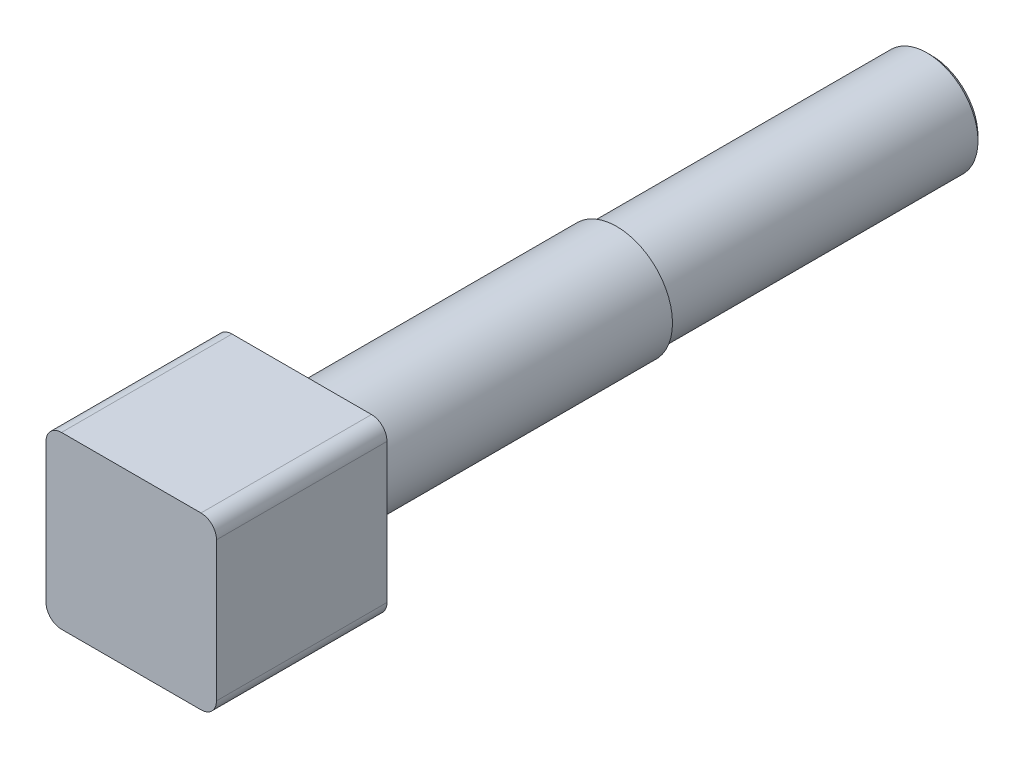
ISO-10303-21;
HEADER;
FILE_DESCRIPTION(('STEP AP214'),'2;1');
FILE_NAME('part.step','',(''),(''),'','','');
FILE_SCHEMA(('AUTOMOTIVE_DESIGN { 1 0 10303 214 1 1 1 1 }'));
ENDSEC;
DATA;
#1=APPLICATION_CONTEXT('core data for automotive mechanical design processes');
#2=APPLICATION_PROTOCOL_DEFINITION('international standard','automotive_design',2000,#1);
#3=PRODUCT_CONTEXT('',#1,'mechanical');
#4=PRODUCT('Part','Part','',(#3));
#5=PRODUCT_RELATED_PRODUCT_CATEGORY('part','',(#4));
#6=PRODUCT_DEFINITION_FORMATION('','',#4);
#7=PRODUCT_DEFINITION_CONTEXT('part definition',#1,'design');
#8=PRODUCT_DEFINITION('design','',#6,#7);
#9=PRODUCT_DEFINITION_SHAPE('','',#8);
#10=(LENGTH_UNIT() NAMED_UNIT(*) SI_UNIT(.MILLI.,.METRE.));
#11=(NAMED_UNIT(*) PLANE_ANGLE_UNIT() SI_UNIT($,.RADIAN.));
#12=(NAMED_UNIT(*) SI_UNIT($,.STERADIAN.) SOLID_ANGLE_UNIT());
#13=UNCERTAINTY_MEASURE_WITH_UNIT(LENGTH_MEASURE(1.E-05),#10,'distance_accuracy_value','');
#14=(GEOMETRIC_REPRESENTATION_CONTEXT(3) GLOBAL_UNCERTAINTY_ASSIGNED_CONTEXT((#13)) GLOBAL_UNIT_ASSIGNED_CONTEXT((#10,
#11,#12)) REPRESENTATION_CONTEXT('',''));
#15=CARTESIAN_POINT('',(0.,0.,0.));
#16=DIRECTION('',(0.,0.,1.));
#17=DIRECTION('',(1.,0.,0.));
#18=AXIS2_PLACEMENT_3D('',#15,#16,#17);
#19=CARTESIAN_POINT('',(0.,0.,203.2));
#20=DIRECTION('',(0.,0.,-1.));
#21=DIRECTION('',(-1.,0.,0.));
#22=AXIS2_PLACEMENT_3D('',#19,#20,#21);
#23=CYLINDRICAL_SURFACE('',#22,18.);
#24=CARTESIAN_POINT('',(0.,0.,101.6));
#25=DIRECTION('',(0.,0.,1.));
#26=DIRECTION('',(1.,0.,0.));
#27=AXIS2_PLACEMENT_3D('',#24,#25,#26);
#28=CIRCLE('',#27,18.);
#29=CARTESIAN_POINT('',(18.,0.,101.6));
#30=VERTEX_POINT('',#29);
#31=EDGE_CURVE('E159',#30,#30,#28,.T.);
#32=ORIENTED_EDGE('',*,*,#31,.T.);
#33=EDGE_LOOP('',(#32));
#34=FACE_BOUND('',#33,.T.);
#35=CARTESIAN_POINT('',(0.,0.,203.2));
#36=DIRECTION('',(0.,0.,1.));
#37=DIRECTION('',(1.,0.,0.));
#38=AXIS2_PLACEMENT_3D('',#35,#36,#37);
#39=CIRCLE('',#38,18.);
#40=CARTESIAN_POINT('',(18.,0.,203.2));
#41=VERTEX_POINT('',#40);
#42=EDGE_CURVE('E124',#41,#41,#39,.T.);
#43=ORIENTED_EDGE('',*,*,#42,.F.);
#44=EDGE_LOOP('',(#43));
#45=FACE_BOUND('',#44,.T.);
#46=ADVANCED_FACE('F17',(#34,#45),#23,.T.);
#47=CARTESIAN_POINT('',(-27.5,27.5,258.2));
#48=DIRECTION('',(1.,0.,0.));
#49=DIRECTION('',(0.,1.,0.));
#50=AXIS2_PLACEMENT_3D('',#47,#48,#49);
#51=PLANE('',#50);
#52=DIRECTION('',(0.,-1.,0.));
#53=VECTOR('',#52,1.);
#54=CARTESIAN_POINT('',(-27.5,27.5,203.2));
#55=LINE('',#54,#53);
#56=CARTESIAN_POINT('',(-27.5,22.5,203.2));
#57=VERTEX_POINT('',#56);
#58=CARTESIAN_POINT('',(-27.5,-22.5,203.2));
#59=VERTEX_POINT('',#58);
#60=EDGE_CURVE('E151',#57,#59,#55,.T.);
#61=ORIENTED_EDGE('',*,*,#60,.T.);
#62=DIRECTION('',(0.,0.,-1.));
#63=VECTOR('',#62,1.);
#64=CARTESIAN_POINT('',(-27.5,-22.5,258.2));
#65=LINE('',#64,#63);
#66=CARTESIAN_POINT('',(-27.5,-22.5,258.2));
#67=VERTEX_POINT('',#66);
#68=EDGE_CURVE('E11',#59,#67,#65,.F.);
#69=ORIENTED_EDGE('',*,*,#68,.T.);
#70=DIRECTION('',(0.,-1.,0.));
#71=VECTOR('',#70,1.);
#72=CARTESIAN_POINT('',(-27.5,27.5,258.2));
#73=LINE('',#72,#71);
#74=CARTESIAN_POINT('',(-27.5,22.5,258.2));
#75=VERTEX_POINT('',#74);
#76=EDGE_CURVE('E109',#75,#67,#73,.T.);
#77=ORIENTED_EDGE('',*,*,#76,.F.);
#78=DIRECTION('',(0.,0.,-1.));
#79=VECTOR('',#78,1.);
#80=CARTESIAN_POINT('',(-27.5,22.5,258.2));
#81=LINE('',#80,#79);
#82=EDGE_CURVE('E25',#75,#57,#81,.T.);
#83=ORIENTED_EDGE('',*,*,#82,.T.);
#84=EDGE_LOOP('',(#61,#69,#77,#83));
#85=FACE_BOUND('',#84,.T.);
#86=ADVANCED_FACE('F150',(#85),#51,.F.);
#87=CARTESIAN_POINT('',(-27.5,-27.5,258.2));
#88=DIRECTION('',(0.,1.,0.));
#89=DIRECTION('',(0.,0.,1.));
#90=AXIS2_PLACEMENT_3D('',#87,#88,#89);
#91=PLANE('',#90);
#92=DIRECTION('',(1.,0.,0.));
#93=VECTOR('',#92,1.);
#94=CARTESIAN_POINT('',(-27.5,-27.5,203.2));
#95=LINE('',#94,#93);
#96=CARTESIAN_POINT('',(-22.5,-27.5,203.2));
#97=VERTEX_POINT('',#96);
#98=CARTESIAN_POINT('',(22.5,-27.5,203.2));
#99=VERTEX_POINT('',#98);
#100=EDGE_CURVE('E114',#97,#99,#95,.T.);
#101=ORIENTED_EDGE('',*,*,#100,.T.);
#102=DIRECTION('',(0.,0.,-1.));
#103=VECTOR('',#102,1.);
#104=CARTESIAN_POINT('',(22.5,-27.5,258.2));
#105=LINE('',#104,#103);
#106=CARTESIAN_POINT('',(22.5,-27.5,258.2));
#107=VERTEX_POINT('',#106);
#108=EDGE_CURVE('E32',#99,#107,#105,.F.);
#109=ORIENTED_EDGE('',*,*,#108,.T.);
#110=DIRECTION('',(1.,0.,0.));
#111=VECTOR('',#110,1.);
#112=CARTESIAN_POINT('',(-27.5,-27.5,258.2));
#113=LINE('',#112,#111);
#114=CARTESIAN_POINT('',(-22.5,-27.5,258.2));
#115=VERTEX_POINT('',#114);
#116=EDGE_CURVE('E112',#115,#107,#113,.T.);
#117=ORIENTED_EDGE('',*,*,#116,.F.);
#118=DIRECTION('',(0.,0.,-1.));
#119=VECTOR('',#118,1.);
#120=CARTESIAN_POINT('',(-22.5,-27.5,258.2));
#121=LINE('',#120,#119);
#122=EDGE_CURVE('E142',#115,#97,#121,.T.);
#123=ORIENTED_EDGE('',*,*,#122,.T.);
#124=EDGE_LOOP('',(#101,#109,#117,#123));
#125=FACE_BOUND('',#124,.T.);
#126=ADVANCED_FACE('F208',(#125),#91,.F.);
#127=CARTESIAN_POINT('',(27.5,27.5,258.2));
#128=DIRECTION('',(-1.,0.,0.));
#129=DIRECTION('',(0.,-1.,0.));
#130=AXIS2_PLACEMENT_3D('',#127,#128,#129);
#131=PLANE('',#130);
#132=DIRECTION('',(0.,1.,0.));
#133=VECTOR('',#132,1.);
#134=CARTESIAN_POINT('',(27.5,27.5,203.2));
#135=LINE('',#134,#133);
#136=CARTESIAN_POINT('',(27.5,-22.5,203.2));
#137=VERTEX_POINT('',#136);
#138=CARTESIAN_POINT('',(27.5,22.5,203.2));
#139=VERTEX_POINT('',#138);
#140=EDGE_CURVE('E110',#137,#139,#135,.T.);
#141=ORIENTED_EDGE('',*,*,#140,.T.);
#142=DIRECTION('',(0.,0.,-1.));
#143=VECTOR('',#142,1.);
#144=CARTESIAN_POINT('',(27.5,22.5,258.2));
#145=LINE('',#144,#143);
#146=CARTESIAN_POINT('',(27.5,22.5,258.2));
#147=VERTEX_POINT('',#146);
#148=EDGE_CURVE('E88',#139,#147,#145,.F.);
#149=ORIENTED_EDGE('',*,*,#148,.T.);
#150=DIRECTION('',(0.,1.,0.));
#151=VECTOR('',#150,1.);
#152=CARTESIAN_POINT('',(27.5,27.5,258.2));
#153=LINE('',#152,#151);
#154=CARTESIAN_POINT('',(27.5,-22.5,258.2));
#155=VERTEX_POINT('',#154);
#156=EDGE_CURVE('E163',#155,#147,#153,.T.);
#157=ORIENTED_EDGE('',*,*,#156,.F.);
#158=DIRECTION('',(0.,0.,-1.));
#159=VECTOR('',#158,1.);
#160=CARTESIAN_POINT('',(27.5,-22.5,258.2));
#161=LINE('',#160,#159);
#162=EDGE_CURVE('E93',#155,#137,#161,.T.);
#163=ORIENTED_EDGE('',*,*,#162,.T.);
#164=EDGE_LOOP('',(#141,#149,#157,#163));
#165=FACE_BOUND('',#164,.T.);
#166=ADVANCED_FACE('F226',(#165),#131,.F.);
#167=CARTESIAN_POINT('',(-27.5,27.5,258.2));
#168=DIRECTION('',(0.,-1.,0.));
#169=DIRECTION('',(0.,0.,-1.));
#170=AXIS2_PLACEMENT_3D('',#167,#168,#169);
#171=PLANE('',#170);
#172=DIRECTION('',(-1.,0.,0.));
#173=VECTOR('',#172,1.);
#174=CARTESIAN_POINT('',(-27.5,27.5,258.2));
#175=LINE('',#174,#173);
#176=CARTESIAN_POINT('',(22.5,27.5,258.2));
#177=VERTEX_POINT('',#176);
#178=CARTESIAN_POINT('',(-22.5,27.5,258.2));
#179=VERTEX_POINT('',#178);
#180=EDGE_CURVE('E103',#177,#179,#175,.T.);
#181=ORIENTED_EDGE('',*,*,#180,.F.);
#182=DIRECTION('',(0.,0.,-1.));
#183=VECTOR('',#182,1.);
#184=CARTESIAN_POINT('',(22.5,27.5,258.2));
#185=LINE('',#184,#183);
#186=CARTESIAN_POINT('',(22.5,27.5,203.2));
#187=VERTEX_POINT('',#186);
#188=EDGE_CURVE('E87',#177,#187,#185,.T.);
#189=ORIENTED_EDGE('',*,*,#188,.T.);
#190=DIRECTION('',(-1.,0.,0.));
#191=VECTOR('',#190,1.);
#192=CARTESIAN_POINT('',(-27.5,27.5,203.2));
#193=LINE('',#192,#191);
#194=CARTESIAN_POINT('',(-22.5,27.5,203.2));
#195=VERTEX_POINT('',#194);
#196=EDGE_CURVE('E100',#187,#195,#193,.T.);
#197=ORIENTED_EDGE('',*,*,#196,.T.);
#198=DIRECTION('',(0.,0.,-1.));
#199=VECTOR('',#198,1.);
#200=CARTESIAN_POINT('',(-22.5,27.5,258.2));
#201=LINE('',#200,#199);
#202=EDGE_CURVE('E105',#195,#179,#201,.F.);
#203=ORIENTED_EDGE('',*,*,#202,.T.);
#204=EDGE_LOOP('',(#181,#189,#197,#203));
#205=FACE_BOUND('',#204,.T.);
#206=ADVANCED_FACE('F99',(#205),#171,.F.);
#207=CARTESIAN_POINT('',(0.,0.,258.2));
#208=DIRECTION('',(0.,0.,1.));
#209=DIRECTION('',(1.,0.,0.));
#210=AXIS2_PLACEMENT_3D('',#207,#208,#209);
#211=PLANE('',#210);
#212=ORIENTED_EDGE('',*,*,#156,.T.);
#213=CARTESIAN_POINT('',(22.5,22.5,258.2));
#214=DIRECTION('',(0.,0.,1.));
#215=DIRECTION('',(1.,0.,0.));
#216=AXIS2_PLACEMENT_3D('',#213,#214,#215);
#217=CIRCLE('',#216,5.);
#218=EDGE_CURVE('E140',#147,#177,#217,.T.);
#219=ORIENTED_EDGE('',*,*,#218,.T.);
#220=ORIENTED_EDGE('',*,*,#180,.T.);
#221=CARTESIAN_POINT('',(-22.5,22.5,258.2));
#222=DIRECTION('',(0.,0.,1.));
#223=DIRECTION('',(1.,0.,0.));
#224=AXIS2_PLACEMENT_3D('',#221,#222,#223);
#225=CIRCLE('',#224,5.);
#226=EDGE_CURVE('E135',#179,#75,#225,.T.);
#227=ORIENTED_EDGE('',*,*,#226,.T.);
#228=ORIENTED_EDGE('',*,*,#76,.T.);
#229=CARTESIAN_POINT('',(-22.5,-22.5,258.2));
#230=DIRECTION('',(0.,0.,1.));
#231=DIRECTION('',(1.,0.,0.));
#232=AXIS2_PLACEMENT_3D('',#229,#230,#231);
#233=CIRCLE('',#232,5.);
#234=EDGE_CURVE('E39',#67,#115,#233,.T.);
#235=ORIENTED_EDGE('',*,*,#234,.T.);
#236=ORIENTED_EDGE('',*,*,#116,.T.);
#237=CARTESIAN_POINT('',(22.5,-22.5,258.2));
#238=DIRECTION('',(0.,0.,1.));
#239=DIRECTION('',(1.,0.,0.));
#240=AXIS2_PLACEMENT_3D('',#237,#238,#239);
#241=CIRCLE('',#240,5.);
#242=EDGE_CURVE('E138',#107,#155,#241,.T.);
#243=ORIENTED_EDGE('',*,*,#242,.T.);
#244=EDGE_LOOP('',(#212,#219,#220,#227,#228,#235,#236,#243));
#245=FACE_BOUND('',#244,.T.);
#246=ADVANCED_FACE('F227',(#245),#211,.T.);
#247=CARTESIAN_POINT('',(0.,0.,203.2));
#248=DIRECTION('',(0.,0.,1.));
#249=DIRECTION('',(1.,0.,0.));
#250=AXIS2_PLACEMENT_3D('',#247,#248,#249);
#251=PLANE('',#250);
#252=ORIENTED_EDGE('',*,*,#42,.T.);
#253=EDGE_LOOP('',(#252));
#254=FACE_BOUND('',#253,.T.);
#255=ORIENTED_EDGE('',*,*,#196,.F.);
#256=CARTESIAN_POINT('',(22.5,22.5,203.2));
#257=DIRECTION('',(0.,0.,1.));
#258=DIRECTION('',(1.,0.,0.));
#259=AXIS2_PLACEMENT_3D('',#256,#257,#258);
#260=CIRCLE('',#259,5.);
#261=EDGE_CURVE('E83',#187,#139,#260,.F.);
#262=ORIENTED_EDGE('',*,*,#261,.T.);
#263=ORIENTED_EDGE('',*,*,#140,.F.);
#264=CARTESIAN_POINT('',(22.5,-22.5,203.2));
#265=DIRECTION('',(0.,0.,1.));
#266=DIRECTION('',(1.,0.,0.));
#267=AXIS2_PLACEMENT_3D('',#264,#265,#266);
#268=CIRCLE('',#267,5.);
#269=EDGE_CURVE('E94',#137,#99,#268,.F.);
#270=ORIENTED_EDGE('',*,*,#269,.T.);
#271=ORIENTED_EDGE('',*,*,#100,.F.);
#272=CARTESIAN_POINT('',(-22.5,-22.5,203.2));
#273=DIRECTION('',(0.,0.,1.));
#274=DIRECTION('',(1.,0.,0.));
#275=AXIS2_PLACEMENT_3D('',#272,#273,#274);
#276=CIRCLE('',#275,5.);
#277=EDGE_CURVE('E129',#97,#59,#276,.F.);
#278=ORIENTED_EDGE('',*,*,#277,.T.);
#279=ORIENTED_EDGE('',*,*,#60,.F.);
#280=CARTESIAN_POINT('',(-22.5,22.5,203.2));
#281=DIRECTION('',(0.,0.,1.));
#282=DIRECTION('',(1.,0.,0.));
#283=AXIS2_PLACEMENT_3D('',#280,#281,#282);
#284=CIRCLE('',#283,5.);
#285=EDGE_CURVE('E104',#57,#195,#284,.F.);
#286=ORIENTED_EDGE('',*,*,#285,.T.);
#287=EDGE_LOOP('',(#255,#262,#263,#270,#271,#278,#279,#286));
#288=FACE_BOUND('',#287,.T.);
#289=ADVANCED_FACE('F107',(#254,#288),#251,.F.);
#290=CARTESIAN_POINT('',(0.,0.,0.));
#291=DIRECTION('',(0.,0.,1.));
#292=DIRECTION('',(1.,0.,0.));
#293=AXIS2_PLACEMENT_3D('',#290,#291,#292);
#294=CYLINDRICAL_SURFACE('',#293,16.4211);
#295=CARTESIAN_POINT('',(0.,0.,101.6));
#296=DIRECTION('',(0.,0.,1.));
#297=DIRECTION('',(1.,0.,0.));
#298=AXIS2_PLACEMENT_3D('',#295,#296,#297);
#299=CIRCLE('',#298,16.4211);
#300=CARTESIAN_POINT('',(16.4211,0.,101.6));
#301=VERTEX_POINT('',#300);
#302=EDGE_CURVE('E156',#301,#301,#299,.T.);
#303=ORIENTED_EDGE('',*,*,#302,.F.);
#304=EDGE_LOOP('',(#303));
#305=FACE_BOUND('',#304,.T.);
#306=CARTESIAN_POINT('',(0.,0.,1.47066));
#307=DIRECTION('',(0.,0.,1.));
#308=DIRECTION('',(1.,0.,0.));
#309=AXIS2_PLACEMENT_3D('',#306,#307,#308);
#310=CIRCLE('',#309,16.4211);
#311=CARTESIAN_POINT('',(16.4211,0.,1.47066));
#312=VERTEX_POINT('',#311);
#313=EDGE_CURVE('E172',#312,#312,#310,.T.);
#314=ORIENTED_EDGE('',*,*,#313,.T.);
#315=EDGE_LOOP('',(#314));
#316=FACE_BOUND('',#315,.T.);
#317=ADVANCED_FACE('F176',(#305,#316),#294,.T.);
#318=CARTESIAN_POINT('',(16.4211,0.,101.6));
#319=DIRECTION('',(0.,0.,1.));
#320=DIRECTION('',(1.,0.,0.));
#321=AXIS2_PLACEMENT_3D('',#318,#319,#320);
#322=PLANE('',#321);
#323=ORIENTED_EDGE('',*,*,#31,.F.);
#324=EDGE_LOOP('',(#323));
#325=FACE_BOUND('',#324,.T.);
#326=ORIENTED_EDGE('',*,*,#302,.T.);
#327=EDGE_LOOP('',(#326));
#328=FACE_BOUND('',#327,.T.);
#329=ADVANCED_FACE('F182',(#325,#328),#322,.F.);
#330=CARTESIAN_POINT('',(0.,0.,0.));
#331=DIRECTION('',(0.,0.,1.));
#332=DIRECTION('',(1.,0.,0.));
#333=AXIS2_PLACEMENT_3D('',#330,#331,#332);
#334=CONICAL_SURFACE('',#333,14.95044,0.785398163397449);
#335=ORIENTED_EDGE('',*,*,#313,.F.);
#336=EDGE_LOOP('',(#335));
#337=FACE_BOUND('',#336,.T.);
#338=CARTESIAN_POINT('',(0.,0.,0.));
#339=DIRECTION('',(0.,0.,1.));
#340=DIRECTION('',(1.,0.,0.));
#341=AXIS2_PLACEMENT_3D('',#338,#339,#340);
#342=CIRCLE('',#341,14.95044);
#343=CARTESIAN_POINT('',(14.95044,0.,0.));
#344=VERTEX_POINT('',#343);
#345=EDGE_CURVE('E169',#344,#344,#342,.T.);
#346=ORIENTED_EDGE('',*,*,#345,.T.);
#347=EDGE_LOOP('',(#346));
#348=FACE_BOUND('',#347,.T.);
#349=ADVANCED_FACE('F178',(#337,#348),#334,.T.);
#350=CARTESIAN_POINT('',(0.,0.,203.2));
#351=DIRECTION('',(0.,0.,1.));
#352=DIRECTION('',(1.,0.,0.));
#353=AXIS2_PLACEMENT_3D('',#350,#351,#352);
#354=CIRCLE('',#353,13.);
#355=CARTESIAN_POINT('',(13.,0.,203.2));
#356=VERTEX_POINT('',#355);
#357=EDGE_CURVE('E118',#356,#356,#354,.T.);
#358=ORIENTED_EDGE('',*,*,#357,.F.);
#359=EDGE_LOOP('',(#358));
#360=FACE_BOUND('',#359,.T.);
#361=ADVANCED_FACE('F181',(#360),#251,.F.);
#362=CARTESIAN_POINT('',(0.,0.,203.2));
#363=DIRECTION('',(0.,0.,-1.));
#364=DIRECTION('',(-1.,0.,0.));
#365=AXIS2_PLACEMENT_3D('',#362,#363,#364);
#366=CYLINDRICAL_SURFACE('',#365,13.);
#367=ORIENTED_EDGE('',*,*,#357,.T.);
#368=EDGE_LOOP('',(#367));
#369=FACE_BOUND('',#368,.T.);
#370=CARTESIAN_POINT('',(0.,0.,0.));
#371=DIRECTION('',(0.,0.,1.));
#372=DIRECTION('',(1.,0.,0.));
#373=AXIS2_PLACEMENT_3D('',#370,#371,#372);
#374=CIRCLE('',#373,13.);
#375=CARTESIAN_POINT('',(13.,0.,0.));
#376=VERTEX_POINT('',#375);
#377=EDGE_CURVE('E121',#376,#376,#374,.T.);
#378=ORIENTED_EDGE('',*,*,#377,.F.);
#379=EDGE_LOOP('',(#378));
#380=FACE_BOUND('',#379,.T.);
#381=ADVANCED_FACE('F188',(#369,#380),#366,.F.);
#382=CARTESIAN_POINT('',(0.,0.,0.));
#383=DIRECTION('',(0.,0.,1.));
#384=DIRECTION('',(1.,0.,0.));
#385=AXIS2_PLACEMENT_3D('',#382,#383,#384);
#386=PLANE('',#385);
#387=ORIENTED_EDGE('',*,*,#377,.T.);
#388=EDGE_LOOP('',(#387));
#389=FACE_BOUND('',#388,.T.);
#390=ORIENTED_EDGE('',*,*,#345,.F.);
#391=EDGE_LOOP('',(#390));
#392=FACE_BOUND('',#391,.T.);
#393=ADVANCED_FACE('F186',(#389,#392),#386,.F.);
#394=CARTESIAN_POINT('',(22.5,22.5,258.2));
#395=DIRECTION('',(0.,0.,-1.));
#396=DIRECTION('',(-1.,0.,0.));
#397=AXIS2_PLACEMENT_3D('',#394,#395,#396);
#398=CYLINDRICAL_SURFACE('',#397,5.);
#399=ORIENTED_EDGE('',*,*,#218,.F.);
#400=ORIENTED_EDGE('',*,*,#148,.F.);
#401=ORIENTED_EDGE('',*,*,#261,.F.);
#402=ORIENTED_EDGE('',*,*,#188,.F.);
#403=EDGE_LOOP('',(#399,#400,#401,#402));
#404=FACE_BOUND('',#403,.T.);
#405=ADVANCED_FACE('F86',(#404),#398,.T.);
#406=CARTESIAN_POINT('',(22.5,-22.5,258.2));
#407=DIRECTION('',(0.,0.,-1.));
#408=DIRECTION('',(-1.,0.,0.));
#409=AXIS2_PLACEMENT_3D('',#406,#407,#408);
#410=CYLINDRICAL_SURFACE('',#409,5.);
#411=ORIENTED_EDGE('',*,*,#242,.F.);
#412=ORIENTED_EDGE('',*,*,#108,.F.);
#413=ORIENTED_EDGE('',*,*,#269,.F.);
#414=ORIENTED_EDGE('',*,*,#162,.F.);
#415=EDGE_LOOP('',(#411,#412,#413,#414));
#416=FACE_BOUND('',#415,.T.);
#417=ADVANCED_FACE('F197',(#416),#410,.T.);
#418=CARTESIAN_POINT('',(-22.5,-22.5,258.2));
#419=DIRECTION('',(0.,0.,-1.));
#420=DIRECTION('',(-1.,0.,0.));
#421=AXIS2_PLACEMENT_3D('',#418,#419,#420);
#422=CYLINDRICAL_SURFACE('',#421,5.);
#423=ORIENTED_EDGE('',*,*,#234,.F.);
#424=ORIENTED_EDGE('',*,*,#68,.F.);
#425=ORIENTED_EDGE('',*,*,#277,.F.);
#426=ORIENTED_EDGE('',*,*,#122,.F.);
#427=EDGE_LOOP('',(#423,#424,#425,#426));
#428=FACE_BOUND('',#427,.T.);
#429=ADVANCED_FACE('F213',(#428),#422,.T.);
#430=CARTESIAN_POINT('',(-22.5,22.5,258.2));
#431=DIRECTION('',(0.,0.,-1.));
#432=DIRECTION('',(-1.,0.,0.));
#433=AXIS2_PLACEMENT_3D('',#430,#431,#432);
#434=CYLINDRICAL_SURFACE('',#433,5.);
#435=ORIENTED_EDGE('',*,*,#226,.F.);
#436=ORIENTED_EDGE('',*,*,#202,.F.);
#437=ORIENTED_EDGE('',*,*,#285,.F.);
#438=ORIENTED_EDGE('',*,*,#82,.F.);
#439=EDGE_LOOP('',(#435,#436,#437,#438));
#440=FACE_BOUND('',#439,.T.);
#441=ADVANCED_FACE('F19',(#440),#434,.T.);
#442=CLOSED_SHELL('',(#46,#86,#126,#166,#206,#246,#289,#317,#329,#349,#361,#381,#393,#405,#417,
#429,#441));
#443=MANIFOLD_SOLID_BREP('B1',#442);
#444=ADVANCED_BREP_SHAPE_REPRESENTATION('',(#18,#443),#14);
#445=SHAPE_DEFINITION_REPRESENTATION(#9,#444);
ENDSEC;
END-ISO-10303-21;
